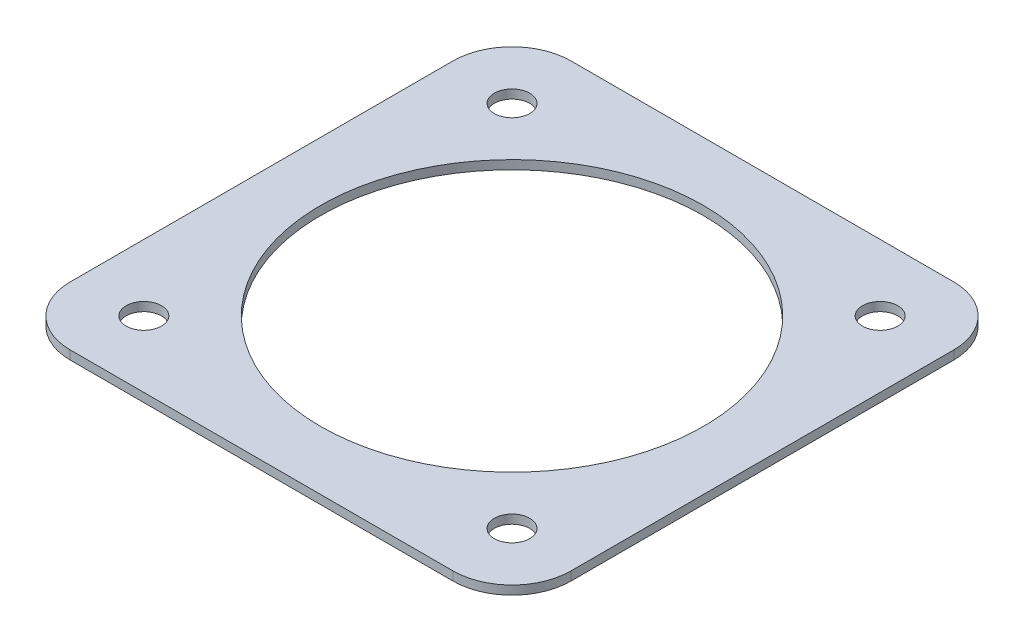
ISO-10303-21;
HEADER;
FILE_DESCRIPTION(('STEP AP214'),'2;1');
FILE_NAME('part.step','',(''),(''),'','','');
FILE_SCHEMA(('AUTOMOTIVE_DESIGN { 1 0 10303 214 1 1 1 1 }'));
ENDSEC;
DATA;
#1=APPLICATION_CONTEXT('core data for automotive mechanical design processes');
#2=APPLICATION_PROTOCOL_DEFINITION('international standard','automotive_design',2000,#1);
#3=PRODUCT_CONTEXT('',#1,'mechanical');
#4=PRODUCT('Part','Part','',(#3));
#5=PRODUCT_RELATED_PRODUCT_CATEGORY('part','',(#4));
#6=PRODUCT_DEFINITION_FORMATION('','',#4);
#7=PRODUCT_DEFINITION_CONTEXT('part definition',#1,'design');
#8=PRODUCT_DEFINITION('design','',#6,#7);
#9=PRODUCT_DEFINITION_SHAPE('','',#8);
#10=(LENGTH_UNIT() NAMED_UNIT(*) SI_UNIT(.MILLI.,.METRE.));
#11=(NAMED_UNIT(*) PLANE_ANGLE_UNIT() SI_UNIT($,.RADIAN.));
#12=(NAMED_UNIT(*) SI_UNIT($,.STERADIAN.) SOLID_ANGLE_UNIT());
#13=UNCERTAINTY_MEASURE_WITH_UNIT(LENGTH_MEASURE(1.E-05),#10,'distance_accuracy_value','');
#14=(GEOMETRIC_REPRESENTATION_CONTEXT(3) GLOBAL_UNCERTAINTY_ASSIGNED_CONTEXT((#13)) GLOBAL_UNIT_ASSIGNED_CONTEXT((#10,
#11,#12)) REPRESENTATION_CONTEXT('',''));
#15=CARTESIAN_POINT('',(0.,0.,0.));
#16=DIRECTION('',(0.,0.,1.));
#17=DIRECTION('',(1.,0.,0.));
#18=AXIS2_PLACEMENT_3D('',#15,#16,#17);
#19=CARTESIAN_POINT('',(-65.,3.,65.));
#20=DIRECTION('',(0.,1.,0.));
#21=DIRECTION('',(0.,0.,1.));
#22=AXIS2_PLACEMENT_3D('',#19,#20,#21);
#23=PLANE('',#22);
#24=CARTESIAN_POINT('',(62.5,3.,-62.5000000000001));
#25=DIRECTION('',(0.,1.,0.));
#26=DIRECTION('',(0.,0.,1.));
#27=AXIS2_PLACEMENT_3D('',#24,#25,#26);
#28=CIRCLE('',#27,6.);
#29=CARTESIAN_POINT('',(62.5,3.,-56.5));
#30=VERTEX_POINT('',#29);
#31=EDGE_CURVE('E205',#30,#30,#28,.T.);
#32=ORIENTED_EDGE('',*,*,#31,.F.);
#33=EDGE_LOOP('',(#32));
#34=FACE_BOUND('',#33,.T.);
#35=CARTESIAN_POINT('',(0.,3.,0.));
#36=DIRECTION('',(0.,1.,0.));
#37=DIRECTION('',(0.,0.,1.));
#38=AXIS2_PLACEMENT_3D('',#35,#36,#37);
#39=CIRCLE('',#38,65.);
#40=CARTESIAN_POINT('',(0.,3.,65.));
#41=VERTEX_POINT('',#40);
#42=EDGE_CURVE('E193',#41,#41,#39,.T.);
#43=ORIENTED_EDGE('',*,*,#42,.F.);
#44=EDGE_LOOP('',(#43));
#45=FACE_BOUND('',#44,.T.);
#46=CARTESIAN_POINT('',(-65.,3.,65.));
#47=DIRECTION('',(0.,1.,0.));
#48=DIRECTION('',(0.,0.,1.));
#49=AXIS2_PLACEMENT_3D('',#46,#47,#48);
#50=CIRCLE('',#49,20.);
#51=CARTESIAN_POINT('',(-85.,3.,64.9999999999999));
#52=VERTEX_POINT('',#51);
#53=CARTESIAN_POINT('',(-64.9999999999998,3.,85.));
#54=VERTEX_POINT('',#53);
#55=EDGE_CURVE('E156',#52,#54,#50,.T.);
#56=ORIENTED_EDGE('',*,*,#55,.T.);
#57=DIRECTION('',(1.,0.,0.));
#58=VECTOR('',#57,1.);
#59=CARTESIAN_POINT('',(64.9999999999999,3.,85.));
#60=LINE('',#59,#58);
#61=CARTESIAN_POINT('',(64.9999999999999,3.,85.));
#62=VERTEX_POINT('',#61);
#63=EDGE_CURVE('E104',#54,#62,#60,.T.);
#64=ORIENTED_EDGE('',*,*,#63,.T.);
#65=CARTESIAN_POINT('',(65.,3.,65.));
#66=DIRECTION('',(0.,1.,0.));
#67=DIRECTION('',(0.,0.,1.));
#68=AXIS2_PLACEMENT_3D('',#65,#66,#67);
#69=CIRCLE('',#68,20.);
#70=CARTESIAN_POINT('',(85.,3.,64.9999999999999));
#71=VERTEX_POINT('',#70);
#72=EDGE_CURVE('E171',#62,#71,#69,.T.);
#73=ORIENTED_EDGE('',*,*,#72,.T.);
#74=DIRECTION('',(0.,0.,-1.));
#75=VECTOR('',#74,1.);
#76=CARTESIAN_POINT('',(85.,3.,64.9999999999999));
#77=LINE('',#76,#75);
#78=CARTESIAN_POINT('',(85.,3.,-64.9999999999999));
#79=VERTEX_POINT('',#78);
#80=EDGE_CURVE('E184',#71,#79,#77,.T.);
#81=ORIENTED_EDGE('',*,*,#80,.T.);
#82=CARTESIAN_POINT('',(65.,3.,-65.));
#83=DIRECTION('',(0.,1.,0.));
#84=DIRECTION('',(0.,0.,1.));
#85=AXIS2_PLACEMENT_3D('',#82,#83,#84);
#86=CIRCLE('',#85,20.);
#87=CARTESIAN_POINT('',(64.9999999999999,3.,-85.));
#88=VERTEX_POINT('',#87);
#89=EDGE_CURVE('E123',#79,#88,#86,.T.);
#90=ORIENTED_EDGE('',*,*,#89,.T.);
#91=DIRECTION('',(-1.,0.,0.));
#92=VECTOR('',#91,1.);
#93=CARTESIAN_POINT('',(64.9999999999999,3.,-85.));
#94=LINE('',#93,#92);
#95=CARTESIAN_POINT('',(-64.9999999999998,3.,-85.));
#96=VERTEX_POINT('',#95);
#97=EDGE_CURVE('E117',#88,#96,#94,.T.);
#98=ORIENTED_EDGE('',*,*,#97,.T.);
#99=CARTESIAN_POINT('',(-65.,3.,-65.));
#100=DIRECTION('',(0.,1.,0.));
#101=DIRECTION('',(0.,0.,1.));
#102=AXIS2_PLACEMENT_3D('',#99,#100,#101);
#103=CIRCLE('',#102,20.);
#104=CARTESIAN_POINT('',(-85.,3.,-64.9999999999998));
#105=VERTEX_POINT('',#104);
#106=EDGE_CURVE('E121',#96,#105,#103,.T.);
#107=ORIENTED_EDGE('',*,*,#106,.T.);
#108=DIRECTION('',(0.,0.,1.));
#109=VECTOR('',#108,1.);
#110=CARTESIAN_POINT('',(-85.,3.,64.9999999999999));
#111=LINE('',#110,#109);
#112=EDGE_CURVE('E61',#105,#52,#111,.T.);
#113=ORIENTED_EDGE('',*,*,#112,.T.);
#114=EDGE_LOOP('',(#56,#64,#73,#81,#90,#98,#107,#113));
#115=FACE_BOUND('',#114,.T.);
#116=CARTESIAN_POINT('',(-62.5,3.,62.5));
#117=DIRECTION('',(0.,1.,0.));
#118=DIRECTION('',(0.,0.,1.));
#119=AXIS2_PLACEMENT_3D('',#116,#117,#118);
#120=CIRCLE('',#119,5.99999999999999);
#121=CARTESIAN_POINT('',(-62.5,3.,68.5));
#122=VERTEX_POINT('',#121);
#123=EDGE_CURVE('E145',#122,#122,#120,.T.);
#124=ORIENTED_EDGE('',*,*,#123,.F.);
#125=EDGE_LOOP('',(#124));
#126=FACE_BOUND('',#125,.T.);
#127=CARTESIAN_POINT('',(-62.5,3.,-62.5));
#128=DIRECTION('',(0.,1.,0.));
#129=DIRECTION('',(0.,0.,1.));
#130=AXIS2_PLACEMENT_3D('',#127,#128,#129);
#131=CIRCLE('',#130,5.99999999999999);
#132=CARTESIAN_POINT('',(-62.5,3.,-56.5));
#133=VERTEX_POINT('',#132);
#134=EDGE_CURVE('E199',#133,#133,#131,.T.);
#135=ORIENTED_EDGE('',*,*,#134,.F.);
#136=EDGE_LOOP('',(#135));
#137=FACE_BOUND('',#136,.T.);
#138=CARTESIAN_POINT('',(62.5,3.,62.5));
#139=DIRECTION('',(0.,1.,0.));
#140=DIRECTION('',(0.,0.,1.));
#141=AXIS2_PLACEMENT_3D('',#138,#139,#140);
#142=CIRCLE('',#141,6.);
#143=CARTESIAN_POINT('',(62.5,3.,68.5));
#144=VERTEX_POINT('',#143);
#145=EDGE_CURVE('E211',#144,#144,#142,.T.);
#146=ORIENTED_EDGE('',*,*,#145,.F.);
#147=EDGE_LOOP('',(#146));
#148=FACE_BOUND('',#147,.T.);
#149=ADVANCED_FACE('F44',(#34,#45,#115,#126,#137,#148),#23,.T.);
#150=CARTESIAN_POINT('',(-65.,0.,65.));
#151=DIRECTION('',(0.,1.,0.));
#152=DIRECTION('',(0.,0.,1.));
#153=AXIS2_PLACEMENT_3D('',#150,#151,#152);
#154=PLANE('',#153);
#155=CARTESIAN_POINT('',(-65.,0.,65.));
#156=DIRECTION('',(0.,1.,0.));
#157=DIRECTION('',(0.,0.,1.));
#158=AXIS2_PLACEMENT_3D('',#155,#156,#157);
#159=CIRCLE('',#158,20.);
#160=CARTESIAN_POINT('',(-85.,0.,64.9999999999999));
#161=VERTEX_POINT('',#160);
#162=CARTESIAN_POINT('',(-64.9999999999998,0.,85.));
#163=VERTEX_POINT('',#162);
#164=EDGE_CURVE('E141',#161,#163,#159,.T.);
#165=ORIENTED_EDGE('',*,*,#164,.F.);
#166=DIRECTION('',(0.,0.,1.));
#167=VECTOR('',#166,1.);
#168=CARTESIAN_POINT('',(-85.,0.,64.9999999999999));
#169=LINE('',#168,#167);
#170=CARTESIAN_POINT('',(-85.,0.,-64.9999999999998));
#171=VERTEX_POINT('',#170);
#172=EDGE_CURVE('E96',#171,#161,#169,.T.);
#173=ORIENTED_EDGE('',*,*,#172,.F.);
#174=CARTESIAN_POINT('',(-65.,0.,-65.));
#175=DIRECTION('',(0.,1.,0.));
#176=DIRECTION('',(0.,0.,1.));
#177=AXIS2_PLACEMENT_3D('',#174,#175,#176);
#178=CIRCLE('',#177,20.);
#179=CARTESIAN_POINT('',(-64.9999999999998,0.,-85.));
#180=VERTEX_POINT('',#179);
#181=EDGE_CURVE('E90',#180,#171,#178,.T.);
#182=ORIENTED_EDGE('',*,*,#181,.F.);
#183=DIRECTION('',(-1.,0.,0.));
#184=VECTOR('',#183,1.);
#185=CARTESIAN_POINT('',(64.9999999999999,0.,-85.));
#186=LINE('',#185,#184);
#187=CARTESIAN_POINT('',(64.9999999999999,0.,-85.));
#188=VERTEX_POINT('',#187);
#189=EDGE_CURVE('E131',#188,#180,#186,.T.);
#190=ORIENTED_EDGE('',*,*,#189,.F.);
#191=CARTESIAN_POINT('',(65.,0.,-65.));
#192=DIRECTION('',(0.,1.,0.));
#193=DIRECTION('',(0.,0.,1.));
#194=AXIS2_PLACEMENT_3D('',#191,#192,#193);
#195=CIRCLE('',#194,20.);
#196=CARTESIAN_POINT('',(85.,0.,-64.9999999999999));
#197=VERTEX_POINT('',#196);
#198=EDGE_CURVE('E151',#197,#188,#195,.T.);
#199=ORIENTED_EDGE('',*,*,#198,.F.);
#200=DIRECTION('',(0.,0.,-1.));
#201=VECTOR('',#200,1.);
#202=CARTESIAN_POINT('',(85.,0.,64.9999999999999));
#203=LINE('',#202,#201);
#204=CARTESIAN_POINT('',(85.,0.,64.9999999999999));
#205=VERTEX_POINT('',#204);
#206=EDGE_CURVE('E149',#205,#197,#203,.T.);
#207=ORIENTED_EDGE('',*,*,#206,.F.);
#208=CARTESIAN_POINT('',(65.,0.,65.));
#209=DIRECTION('',(0.,1.,0.));
#210=DIRECTION('',(0.,0.,1.));
#211=AXIS2_PLACEMENT_3D('',#208,#209,#210);
#212=CIRCLE('',#211,20.);
#213=CARTESIAN_POINT('',(64.9999999999999,0.,85.));
#214=VERTEX_POINT('',#213);
#215=EDGE_CURVE('E147',#214,#205,#212,.T.);
#216=ORIENTED_EDGE('',*,*,#215,.F.);
#217=DIRECTION('',(1.,0.,0.));
#218=VECTOR('',#217,1.);
#219=CARTESIAN_POINT('',(64.9999999999999,0.,85.));
#220=LINE('',#219,#218);
#221=EDGE_CURVE('E144',#163,#214,#220,.T.);
#222=ORIENTED_EDGE('',*,*,#221,.F.);
#223=EDGE_LOOP('',(#165,#173,#182,#190,#199,#207,#216,#222));
#224=FACE_BOUND('',#223,.T.);
#225=CARTESIAN_POINT('',(-62.5,0.,62.5));
#226=DIRECTION('',(0.,1.,0.));
#227=DIRECTION('',(0.,0.,1.));
#228=AXIS2_PLACEMENT_3D('',#225,#226,#227);
#229=CIRCLE('',#228,5.99999999999999);
#230=CARTESIAN_POINT('',(-62.5,0.,68.5));
#231=VERTEX_POINT('',#230);
#232=EDGE_CURVE('E190',#231,#231,#229,.T.);
#233=ORIENTED_EDGE('',*,*,#232,.T.);
#234=EDGE_LOOP('',(#233));
#235=FACE_BOUND('',#234,.T.);
#236=CARTESIAN_POINT('',(0.,0.,0.));
#237=DIRECTION('',(0.,1.,0.));
#238=DIRECTION('',(0.,0.,1.));
#239=AXIS2_PLACEMENT_3D('',#236,#237,#238);
#240=CIRCLE('',#239,65.);
#241=CARTESIAN_POINT('',(0.,0.,65.));
#242=VERTEX_POINT('',#241);
#243=EDGE_CURVE('E196',#242,#242,#240,.T.);
#244=ORIENTED_EDGE('',*,*,#243,.T.);
#245=EDGE_LOOP('',(#244));
#246=FACE_BOUND('',#245,.T.);
#247=CARTESIAN_POINT('',(-62.5,0.,-62.5));
#248=DIRECTION('',(0.,1.,0.));
#249=DIRECTION('',(0.,0.,1.));
#250=AXIS2_PLACEMENT_3D('',#247,#248,#249);
#251=CIRCLE('',#250,5.99999999999999);
#252=CARTESIAN_POINT('',(-62.5,0.,-56.5));
#253=VERTEX_POINT('',#252);
#254=EDGE_CURVE('E202',#253,#253,#251,.T.);
#255=ORIENTED_EDGE('',*,*,#254,.T.);
#256=EDGE_LOOP('',(#255));
#257=FACE_BOUND('',#256,.T.);
#258=CARTESIAN_POINT('',(62.5,0.,-62.5000000000001));
#259=DIRECTION('',(0.,1.,0.));
#260=DIRECTION('',(0.,0.,1.));
#261=AXIS2_PLACEMENT_3D('',#258,#259,#260);
#262=CIRCLE('',#261,6.);
#263=CARTESIAN_POINT('',(62.5,0.,-56.5));
#264=VERTEX_POINT('',#263);
#265=EDGE_CURVE('E208',#264,#264,#262,.T.);
#266=ORIENTED_EDGE('',*,*,#265,.T.);
#267=EDGE_LOOP('',(#266));
#268=FACE_BOUND('',#267,.T.);
#269=CARTESIAN_POINT('',(62.5,0.,62.5));
#270=DIRECTION('',(0.,1.,0.));
#271=DIRECTION('',(0.,0.,1.));
#272=AXIS2_PLACEMENT_3D('',#269,#270,#271);
#273=CIRCLE('',#272,6.);
#274=CARTESIAN_POINT('',(62.5,0.,68.5));
#275=VERTEX_POINT('',#274);
#276=EDGE_CURVE('E214',#275,#275,#273,.T.);
#277=ORIENTED_EDGE('',*,*,#276,.T.);
#278=EDGE_LOOP('',(#277));
#279=FACE_BOUND('',#278,.T.);
#280=ADVANCED_FACE('F175',(#224,#235,#246,#257,#268,#279),#154,.F.);
#281=CARTESIAN_POINT('',(-65.,3.,65.));
#282=DIRECTION('',(0.,-1.,0.));
#283=DIRECTION('',(0.,0.,-1.));
#284=AXIS2_PLACEMENT_3D('',#281,#282,#283);
#285=CYLINDRICAL_SURFACE('',#284,20.);
#286=ORIENTED_EDGE('',*,*,#164,.T.);
#287=DIRECTION('',(0.,-1.,0.));
#288=VECTOR('',#287,1.);
#289=CARTESIAN_POINT('',(-64.9999999999998,3.,85.));
#290=LINE('',#289,#288);
#291=EDGE_CURVE('E13',#54,#163,#290,.T.);
#292=ORIENTED_EDGE('',*,*,#291,.F.);
#293=ORIENTED_EDGE('',*,*,#55,.F.);
#294=DIRECTION('',(0.,-1.,0.));
#295=VECTOR('',#294,1.);
#296=CARTESIAN_POINT('',(-85.,3.,64.9999999999999));
#297=LINE('',#296,#295);
#298=EDGE_CURVE('E137',#52,#161,#297,.T.);
#299=ORIENTED_EDGE('',*,*,#298,.T.);
#300=EDGE_LOOP('',(#286,#292,#293,#299));
#301=FACE_BOUND('',#300,.T.);
#302=ADVANCED_FACE('F46',(#301),#285,.T.);
#303=CARTESIAN_POINT('',(64.9999999999999,3.,85.));
#304=DIRECTION('',(0.,0.,-1.));
#305=DIRECTION('',(-1.,0.,0.));
#306=AXIS2_PLACEMENT_3D('',#303,#304,#305);
#307=PLANE('',#306);
#308=ORIENTED_EDGE('',*,*,#221,.T.);
#309=DIRECTION('',(0.,-1.,0.));
#310=VECTOR('',#309,1.);
#311=CARTESIAN_POINT('',(64.9999999999999,3.,85.));
#312=LINE('',#311,#310);
#313=EDGE_CURVE('E53',#62,#214,#312,.T.);
#314=ORIENTED_EDGE('',*,*,#313,.F.);
#315=ORIENTED_EDGE('',*,*,#63,.F.);
#316=ORIENTED_EDGE('',*,*,#291,.T.);
#317=EDGE_LOOP('',(#308,#314,#315,#316));
#318=FACE_BOUND('',#317,.T.);
#319=ADVANCED_FACE('F248',(#318),#307,.F.);
#320=CARTESIAN_POINT('',(65.,3.,65.));
#321=DIRECTION('',(0.,-1.,0.));
#322=DIRECTION('',(0.,0.,-1.));
#323=AXIS2_PLACEMENT_3D('',#320,#321,#322);
#324=CYLINDRICAL_SURFACE('',#323,20.);
#325=ORIENTED_EDGE('',*,*,#215,.T.);
#326=DIRECTION('',(0.,-1.,0.));
#327=VECTOR('',#326,1.);
#328=CARTESIAN_POINT('',(85.,3.,64.9999999999999));
#329=LINE('',#328,#327);
#330=EDGE_CURVE('E163',#71,#205,#329,.T.);
#331=ORIENTED_EDGE('',*,*,#330,.F.);
#332=ORIENTED_EDGE('',*,*,#72,.F.);
#333=ORIENTED_EDGE('',*,*,#313,.T.);
#334=EDGE_LOOP('',(#325,#331,#332,#333));
#335=FACE_BOUND('',#334,.T.);
#336=ADVANCED_FACE('F169',(#335),#324,.T.);
#337=CARTESIAN_POINT('',(85.,3.,64.9999999999999));
#338=DIRECTION('',(-1.,0.,0.));
#339=DIRECTION('',(0.,0.,1.));
#340=AXIS2_PLACEMENT_3D('',#337,#338,#339);
#341=PLANE('',#340);
#342=ORIENTED_EDGE('',*,*,#206,.T.);
#343=DIRECTION('',(0.,-1.,0.));
#344=VECTOR('',#343,1.);
#345=CARTESIAN_POINT('',(85.,3.,-64.9999999999999));
#346=LINE('',#345,#344);
#347=EDGE_CURVE('E160',#79,#197,#346,.T.);
#348=ORIENTED_EDGE('',*,*,#347,.F.);
#349=ORIENTED_EDGE('',*,*,#80,.F.);
#350=ORIENTED_EDGE('',*,*,#330,.T.);
#351=EDGE_LOOP('',(#342,#348,#349,#350));
#352=FACE_BOUND('',#351,.T.);
#353=ADVANCED_FACE('F180',(#352),#341,.F.);
#354=CARTESIAN_POINT('',(65.,3.,-65.));
#355=DIRECTION('',(0.,-1.,0.));
#356=DIRECTION('',(0.,0.,-1.));
#357=AXIS2_PLACEMENT_3D('',#354,#355,#356);
#358=CYLINDRICAL_SURFACE('',#357,20.);
#359=ORIENTED_EDGE('',*,*,#198,.T.);
#360=DIRECTION('',(0.,-1.,0.));
#361=VECTOR('',#360,1.);
#362=CARTESIAN_POINT('',(64.9999999999999,3.,-85.));
#363=LINE('',#362,#361);
#364=EDGE_CURVE('E132',#88,#188,#363,.T.);
#365=ORIENTED_EDGE('',*,*,#364,.F.);
#366=ORIENTED_EDGE('',*,*,#89,.F.);
#367=ORIENTED_EDGE('',*,*,#347,.T.);
#368=EDGE_LOOP('',(#359,#365,#366,#367));
#369=FACE_BOUND('',#368,.T.);
#370=ADVANCED_FACE('F183',(#369),#358,.T.);
#371=CARTESIAN_POINT('',(64.9999999999999,3.,-85.));
#372=DIRECTION('',(0.,0.,1.));
#373=DIRECTION('',(1.,0.,0.));
#374=AXIS2_PLACEMENT_3D('',#371,#372,#373);
#375=PLANE('',#374);
#376=ORIENTED_EDGE('',*,*,#189,.T.);
#377=DIRECTION('',(0.,-1.,0.));
#378=VECTOR('',#377,1.);
#379=CARTESIAN_POINT('',(-64.9999999999998,3.,-85.));
#380=LINE('',#379,#378);
#381=EDGE_CURVE('E128',#96,#180,#380,.T.);
#382=ORIENTED_EDGE('',*,*,#381,.F.);
#383=ORIENTED_EDGE('',*,*,#97,.F.);
#384=ORIENTED_EDGE('',*,*,#364,.T.);
#385=EDGE_LOOP('',(#376,#382,#383,#384));
#386=FACE_BOUND('',#385,.T.);
#387=ADVANCED_FACE('F129',(#386),#375,.F.);
#388=CARTESIAN_POINT('',(-65.,3.,-65.));
#389=DIRECTION('',(0.,-1.,0.));
#390=DIRECTION('',(0.,0.,-1.));
#391=AXIS2_PLACEMENT_3D('',#388,#389,#390);
#392=CYLINDRICAL_SURFACE('',#391,20.);
#393=ORIENTED_EDGE('',*,*,#181,.T.);
#394=DIRECTION('',(0.,-1.,0.));
#395=VECTOR('',#394,1.);
#396=CARTESIAN_POINT('',(-85.,3.,-64.9999999999998));
#397=LINE('',#396,#395);
#398=EDGE_CURVE('E133',#105,#171,#397,.T.);
#399=ORIENTED_EDGE('',*,*,#398,.F.);
#400=ORIENTED_EDGE('',*,*,#106,.F.);
#401=ORIENTED_EDGE('',*,*,#381,.T.);
#402=EDGE_LOOP('',(#393,#399,#400,#401));
#403=FACE_BOUND('',#402,.T.);
#404=ADVANCED_FACE('F135',(#403),#392,.T.);
#405=CARTESIAN_POINT('',(-85.,3.,64.9999999999999));
#406=DIRECTION('',(1.,0.,0.));
#407=DIRECTION('',(0.,0.,-1.));
#408=AXIS2_PLACEMENT_3D('',#405,#406,#407);
#409=PLANE('',#408);
#410=ORIENTED_EDGE('',*,*,#172,.T.);
#411=ORIENTED_EDGE('',*,*,#298,.F.);
#412=ORIENTED_EDGE('',*,*,#112,.F.);
#413=ORIENTED_EDGE('',*,*,#398,.T.);
#414=EDGE_LOOP('',(#410,#411,#412,#413));
#415=FACE_BOUND('',#414,.T.);
#416=ADVANCED_FACE('F236',(#415),#409,.F.);
#417=CARTESIAN_POINT('',(-62.5,3.,62.5));
#418=DIRECTION('',(0.,-1.,0.));
#419=DIRECTION('',(0.,0.,-1.));
#420=AXIS2_PLACEMENT_3D('',#417,#418,#419);
#421=CYLINDRICAL_SURFACE('',#420,5.99999999999999);
#422=ORIENTED_EDGE('',*,*,#123,.T.);
#423=EDGE_LOOP('',(#422));
#424=FACE_BOUND('',#423,.T.);
#425=ORIENTED_EDGE('',*,*,#232,.F.);
#426=EDGE_LOOP('',(#425));
#427=FACE_BOUND('',#426,.T.);
#428=ADVANCED_FACE('F233',(#424,#427),#421,.F.);
#429=CARTESIAN_POINT('',(0.,3.,0.));
#430=DIRECTION('',(0.,-1.,0.));
#431=DIRECTION('',(0.,0.,-1.));
#432=AXIS2_PLACEMENT_3D('',#429,#430,#431);
#433=CYLINDRICAL_SURFACE('',#432,65.);
#434=ORIENTED_EDGE('',*,*,#42,.T.);
#435=EDGE_LOOP('',(#434));
#436=FACE_BOUND('',#435,.T.);
#437=ORIENTED_EDGE('',*,*,#243,.F.);
#438=EDGE_LOOP('',(#437));
#439=FACE_BOUND('',#438,.T.);
#440=ADVANCED_FACE('F312',(#436,#439),#433,.F.);
#441=CARTESIAN_POINT('',(-62.5,3.,-62.5));
#442=DIRECTION('',(0.,-1.,0.));
#443=DIRECTION('',(0.,0.,-1.));
#444=AXIS2_PLACEMENT_3D('',#441,#442,#443);
#445=CYLINDRICAL_SURFACE('',#444,5.99999999999999);
#446=ORIENTED_EDGE('',*,*,#134,.T.);
#447=EDGE_LOOP('',(#446));
#448=FACE_BOUND('',#447,.T.);
#449=ORIENTED_EDGE('',*,*,#254,.F.);
#450=EDGE_LOOP('',(#449));
#451=FACE_BOUND('',#450,.T.);
#452=ADVANCED_FACE('F320',(#448,#451),#445,.F.);
#453=CARTESIAN_POINT('',(62.5,3.,-62.5000000000001));
#454=DIRECTION('',(0.,-1.,0.));
#455=DIRECTION('',(0.,0.,-1.));
#456=AXIS2_PLACEMENT_3D('',#453,#454,#455);
#457=CYLINDRICAL_SURFACE('',#456,6.);
#458=ORIENTED_EDGE('',*,*,#31,.T.);
#459=EDGE_LOOP('',(#458));
#460=FACE_BOUND('',#459,.T.);
#461=ORIENTED_EDGE('',*,*,#265,.F.);
#462=EDGE_LOOP('',(#461));
#463=FACE_BOUND('',#462,.T.);
#464=ADVANCED_FACE('F328',(#460,#463),#457,.F.);
#465=CARTESIAN_POINT('',(62.5,3.,62.5));
#466=DIRECTION('',(0.,-1.,0.));
#467=DIRECTION('',(0.,0.,-1.));
#468=AXIS2_PLACEMENT_3D('',#465,#466,#467);
#469=CYLINDRICAL_SURFACE('',#468,6.);
#470=ORIENTED_EDGE('',*,*,#145,.T.);
#471=EDGE_LOOP('',(#470));
#472=FACE_BOUND('',#471,.T.);
#473=ORIENTED_EDGE('',*,*,#276,.F.);
#474=EDGE_LOOP('',(#473));
#475=FACE_BOUND('',#474,.T.);
#476=ADVANCED_FACE('F220',(#472,#475),#469,.F.);
#477=CLOSED_SHELL('',(#149,#280,#302,#319,#336,#353,#370,#387,#404,#416,#428,#440,#452,#464,#476));
#478=MANIFOLD_SOLID_BREP('B2',#477);
#479=ADVANCED_BREP_SHAPE_REPRESENTATION('',(#18,#478),#14);
#480=SHAPE_DEFINITION_REPRESENTATION(#9,#479);
ENDSEC;
END-ISO-10303-21;
